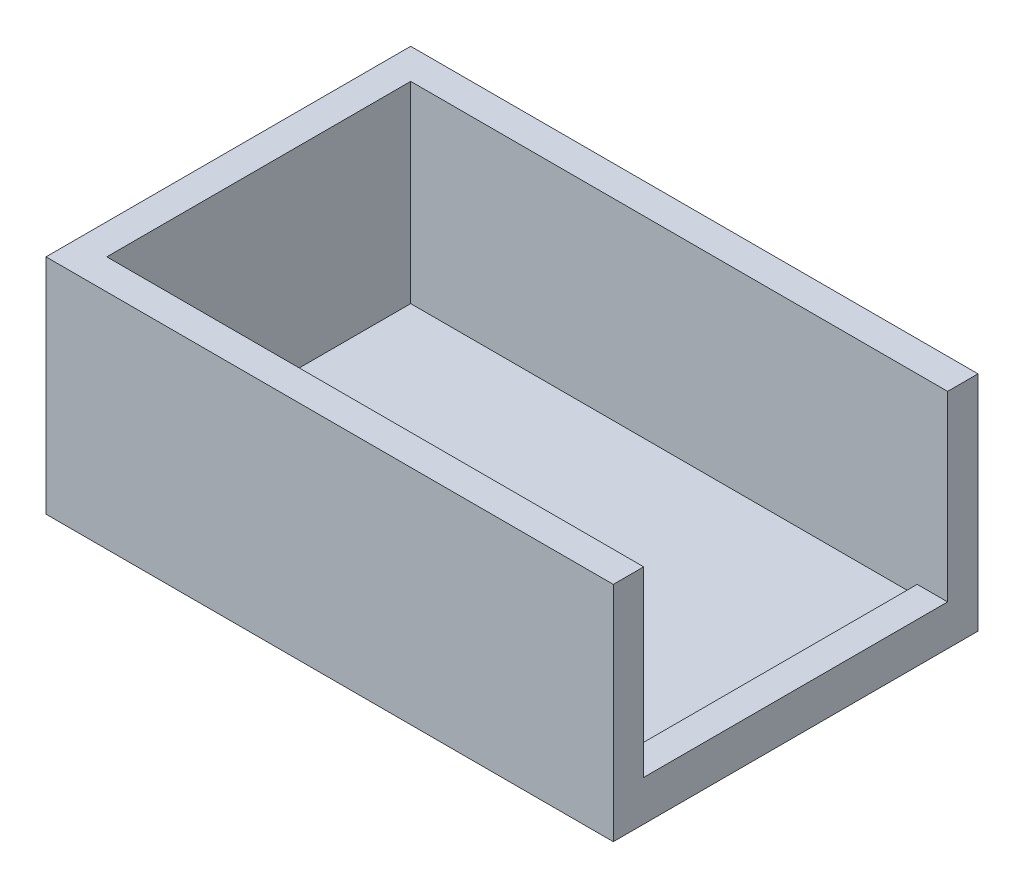
ISO-10303-21;
HEADER;
FILE_DESCRIPTION(('STEP AP214'),'2;1');
FILE_NAME('part.step','',(''),(''),'','','');
FILE_SCHEMA(('AUTOMOTIVE_DESIGN { 1 0 10303 214 1 1 1 1 }'));
ENDSEC;
DATA;
#1=APPLICATION_CONTEXT('core data for automotive mechanical design processes');
#2=APPLICATION_PROTOCOL_DEFINITION('international standard','automotive_design',2000,#1);
#3=PRODUCT_CONTEXT('',#1,'mechanical');
#4=PRODUCT('Part','Part','',(#3));
#5=PRODUCT_RELATED_PRODUCT_CATEGORY('part','',(#4));
#6=PRODUCT_DEFINITION_FORMATION('','',#4);
#7=PRODUCT_DEFINITION_CONTEXT('part definition',#1,'design');
#8=PRODUCT_DEFINITION('design','',#6,#7);
#9=PRODUCT_DEFINITION_SHAPE('','',#8);
#10=(LENGTH_UNIT() NAMED_UNIT(*) SI_UNIT(.MILLI.,.METRE.));
#11=(NAMED_UNIT(*) PLANE_ANGLE_UNIT() SI_UNIT($,.RADIAN.));
#12=(NAMED_UNIT(*) SI_UNIT($,.STERADIAN.) SOLID_ANGLE_UNIT());
#13=UNCERTAINTY_MEASURE_WITH_UNIT(LENGTH_MEASURE(1.E-05),#10,'distance_accuracy_value','');
#14=(GEOMETRIC_REPRESENTATION_CONTEXT(3) GLOBAL_UNCERTAINTY_ASSIGNED_CONTEXT((#13)) GLOBAL_UNIT_ASSIGNED_CONTEXT((#10,
#11,#12)) REPRESENTATION_CONTEXT('',''));
#15=CARTESIAN_POINT('',(0.,0.,0.));
#16=DIRECTION('',(0.,0.,1.));
#17=DIRECTION('',(1.,0.,0.));
#18=AXIS2_PLACEMENT_3D('',#15,#16,#17);
#19=CARTESIAN_POINT('',(25.,3.,-15.));
#20=DIRECTION('',(1.,0.,0.));
#21=DIRECTION('',(0.,0.,-1.));
#22=AXIS2_PLACEMENT_3D('',#19,#20,#21);
#23=PLANE('',#22);
#24=DIRECTION('',(0.,0.,1.));
#25=VECTOR('',#24,1.);
#26=CARTESIAN_POINT('',(25.,4.,-15.));
#27=LINE('',#26,#25);
#28=CARTESIAN_POINT('',(25.,4.,-15.));
#29=VERTEX_POINT('',#28);
#30=CARTESIAN_POINT('',(25.,4.,15.));
#31=VERTEX_POINT('',#30);
#32=EDGE_CURVE('E50',#29,#31,#27,.T.);
#33=ORIENTED_EDGE('',*,*,#32,.F.);
#34=DIRECTION('',(0.,1.,0.));
#35=VECTOR('',#34,1.);
#36=CARTESIAN_POINT('',(25.,3.,-15.));
#37=LINE('',#36,#35);
#38=CARTESIAN_POINT('',(25.,3.,-15.));
#39=VERTEX_POINT('',#38);
#40=EDGE_CURVE('E159',#39,#29,#37,.T.);
#41=ORIENTED_EDGE('',*,*,#40,.F.);
#42=DIRECTION('',(0.,0.,-1.));
#43=VECTOR('',#42,1.);
#44=CARTESIAN_POINT('',(25.,3.,-15.));
#45=LINE('',#44,#43);
#46=CARTESIAN_POINT('',(25.,3.,15.));
#47=VERTEX_POINT('',#46);
#48=EDGE_CURVE('E145',#47,#39,#45,.T.);
#49=ORIENTED_EDGE('',*,*,#48,.F.);
#50=DIRECTION('',(0.,1.,0.));
#51=VECTOR('',#50,1.);
#52=CARTESIAN_POINT('',(25.,3.,15.));
#53=LINE('',#52,#51);
#54=EDGE_CURVE('E162',#47,#31,#53,.T.);
#55=ORIENTED_EDGE('',*,*,#54,.T.);
#56=EDGE_LOOP('',(#33,#41,#49,#55));
#57=FACE_BOUND('',#56,.T.);
#58=ADVANCED_FACE('F35',(#57),#23,.F.);
#59=CARTESIAN_POINT('',(-28.,22.,-18.));
#60=DIRECTION('',(1.,0.,0.));
#61=DIRECTION('',(0.,0.,-1.));
#62=AXIS2_PLACEMENT_3D('',#59,#60,#61);
#63=PLANE('',#62);
#64=DIRECTION('',(0.,0.,1.));
#65=VECTOR('',#64,1.);
#66=CARTESIAN_POINT('',(-28.,0.,-18.));
#67=LINE('',#66,#65);
#68=CARTESIAN_POINT('',(-28.,0.,-18.));
#69=VERTEX_POINT('',#68);
#70=CARTESIAN_POINT('',(-28.,0.,18.));
#71=VERTEX_POINT('',#70);
#72=EDGE_CURVE('E158',#69,#71,#67,.T.);
#73=ORIENTED_EDGE('',*,*,#72,.T.);
#74=DIRECTION('',(0.,-1.,0.));
#75=VECTOR('',#74,1.);
#76=CARTESIAN_POINT('',(-28.,22.,18.));
#77=LINE('',#76,#75);
#78=CARTESIAN_POINT('',(-28.,22.,18.));
#79=VERTEX_POINT('',#78);
#80=EDGE_CURVE('E11',#79,#71,#77,.T.);
#81=ORIENTED_EDGE('',*,*,#80,.F.);
#82=DIRECTION('',(0.,0.,1.));
#83=VECTOR('',#82,1.);
#84=CARTESIAN_POINT('',(-28.,22.,-18.));
#85=LINE('',#84,#83);
#86=CARTESIAN_POINT('',(-28.,22.,-18.));
#87=VERTEX_POINT('',#86);
#88=EDGE_CURVE('E165',#87,#79,#85,.T.);
#89=ORIENTED_EDGE('',*,*,#88,.F.);
#90=DIRECTION('',(0.,-1.,0.));
#91=VECTOR('',#90,1.);
#92=CARTESIAN_POINT('',(-28.,22.,-18.));
#93=LINE('',#92,#91);
#94=EDGE_CURVE('E176',#87,#69,#93,.T.);
#95=ORIENTED_EDGE('',*,*,#94,.T.);
#96=EDGE_LOOP('',(#73,#81,#89,#95));
#97=FACE_BOUND('',#96,.T.);
#98=ADVANCED_FACE('F37',(#97),#63,.F.);
#99=CARTESIAN_POINT('',(-28.,22.,18.));
#100=DIRECTION('',(0.,0.,-1.));
#101=DIRECTION('',(-1.,0.,0.));
#102=AXIS2_PLACEMENT_3D('',#99,#100,#101);
#103=PLANE('',#102);
#104=DIRECTION('',(1.,0.,0.));
#105=VECTOR('',#104,1.);
#106=CARTESIAN_POINT('',(-28.,0.,18.));
#107=LINE('',#106,#105);
#108=CARTESIAN_POINT('',(28.,0.,18.));
#109=VERTEX_POINT('',#108);
#110=EDGE_CURVE('E179',#71,#109,#107,.T.);
#111=ORIENTED_EDGE('',*,*,#110,.T.);
#112=DIRECTION('',(0.,-1.,0.));
#113=VECTOR('',#112,1.);
#114=CARTESIAN_POINT('',(28.,22.,18.));
#115=LINE('',#114,#113);
#116=CARTESIAN_POINT('',(28.,22.,18.));
#117=VERTEX_POINT('',#116);
#118=EDGE_CURVE('E43',#117,#109,#115,.T.);
#119=ORIENTED_EDGE('',*,*,#118,.F.);
#120=DIRECTION('',(1.,0.,0.));
#121=VECTOR('',#120,1.);
#122=CARTESIAN_POINT('',(-28.,22.,18.));
#123=LINE('',#122,#121);
#124=EDGE_CURVE('E168',#79,#117,#123,.T.);
#125=ORIENTED_EDGE('',*,*,#124,.F.);
#126=ORIENTED_EDGE('',*,*,#80,.T.);
#127=EDGE_LOOP('',(#111,#119,#125,#126));
#128=FACE_BOUND('',#127,.T.);
#129=ADVANCED_FACE('F231',(#128),#103,.F.);
#130=CARTESIAN_POINT('',(28.,22.,-18.));
#131=DIRECTION('',(-1.,0.,0.));
#132=DIRECTION('',(0.,0.,1.));
#133=AXIS2_PLACEMENT_3D('',#130,#131,#132);
#134=PLANE('',#133);
#135=DIRECTION('',(0.,0.,-1.));
#136=VECTOR('',#135,1.);
#137=CARTESIAN_POINT('',(28.,22.,-18.));
#138=LINE('',#137,#136);
#139=CARTESIAN_POINT('',(28.,22.,-15.));
#140=VERTEX_POINT('',#139);
#141=CARTESIAN_POINT('',(28.,22.,-18.));
#142=VERTEX_POINT('',#141);
#143=EDGE_CURVE('E171',#140,#142,#138,.T.);
#144=ORIENTED_EDGE('',*,*,#143,.F.);
#145=DIRECTION('',(0.,1.,0.));
#146=VECTOR('',#145,1.);
#147=CARTESIAN_POINT('',(28.,4.,-15.));
#148=LINE('',#147,#146);
#149=CARTESIAN_POINT('',(28.,4.,-15.));
#150=VERTEX_POINT('',#149);
#151=EDGE_CURVE('E122',#150,#140,#148,.T.);
#152=ORIENTED_EDGE('',*,*,#151,.F.);
#153=DIRECTION('',(0.,0.,-1.));
#154=VECTOR('',#153,1.);
#155=CARTESIAN_POINT('',(28.,4.,-15.));
#156=LINE('',#155,#154);
#157=CARTESIAN_POINT('',(28.,4.,15.));
#158=VERTEX_POINT('',#157);
#159=EDGE_CURVE('E126',#158,#150,#156,.T.);
#160=ORIENTED_EDGE('',*,*,#159,.F.);
#161=DIRECTION('',(0.,1.,0.));
#162=VECTOR('',#161,1.);
#163=CARTESIAN_POINT('',(28.,4.,15.));
#164=LINE('',#163,#162);
#165=CARTESIAN_POINT('',(28.,22.,15.));
#166=VERTEX_POINT('',#165);
#167=EDGE_CURVE('E112',#158,#166,#164,.T.);
#168=ORIENTED_EDGE('',*,*,#167,.T.);
#169=EDGE_CURVE('E172',#117,#166,#138,.T.);
#170=ORIENTED_EDGE('',*,*,#169,.F.);
#171=ORIENTED_EDGE('',*,*,#118,.T.);
#172=DIRECTION('',(0.,0.,-1.));
#173=VECTOR('',#172,1.);
#174=CARTESIAN_POINT('',(28.,0.,-18.));
#175=LINE('',#174,#173);
#176=CARTESIAN_POINT('',(28.,0.,-18.));
#177=VERTEX_POINT('',#176);
#178=EDGE_CURVE('E181',#109,#177,#175,.T.);
#179=ORIENTED_EDGE('',*,*,#178,.T.);
#180=DIRECTION('',(0.,-1.,0.));
#181=VECTOR('',#180,1.);
#182=CARTESIAN_POINT('',(28.,22.,-18.));
#183=LINE('',#182,#181);
#184=EDGE_CURVE('E186',#142,#177,#183,.T.);
#185=ORIENTED_EDGE('',*,*,#184,.F.);
#186=EDGE_LOOP('',(#144,#152,#160,#168,#170,#171,#179,#185));
#187=FACE_BOUND('',#186,.T.);
#188=ADVANCED_FACE('F131',(#187),#134,.F.);
#189=CARTESIAN_POINT('',(-28.,22.,-18.));
#190=DIRECTION('',(0.,0.,1.));
#191=DIRECTION('',(1.,0.,0.));
#192=AXIS2_PLACEMENT_3D('',#189,#190,#191);
#193=PLANE('',#192);
#194=DIRECTION('',(-1.,0.,0.));
#195=VECTOR('',#194,1.);
#196=CARTESIAN_POINT('',(-28.,0.,-18.));
#197=LINE('',#196,#195);
#198=EDGE_CURVE('E169',#177,#69,#197,.T.);
#199=ORIENTED_EDGE('',*,*,#198,.T.);
#200=ORIENTED_EDGE('',*,*,#94,.F.);
#201=DIRECTION('',(-1.,0.,0.));
#202=VECTOR('',#201,1.);
#203=CARTESIAN_POINT('',(-28.,22.,-18.));
#204=LINE('',#203,#202);
#205=EDGE_CURVE('E174',#142,#87,#204,.T.);
#206=ORIENTED_EDGE('',*,*,#205,.F.);
#207=ORIENTED_EDGE('',*,*,#184,.T.);
#208=EDGE_LOOP('',(#199,#200,#206,#207));
#209=FACE_BOUND('',#208,.T.);
#210=ADVANCED_FACE('F199',(#209),#193,.F.);
#211=CARTESIAN_POINT('',(0.,22.,0.));
#212=DIRECTION('',(0.,1.,0.));
#213=DIRECTION('',(0.,0.,1.));
#214=AXIS2_PLACEMENT_3D('',#211,#212,#213);
#215=PLANE('',#214);
#216=DIRECTION('',(-1.,0.,0.));
#217=VECTOR('',#216,1.);
#218=CARTESIAN_POINT('',(-25.,22.,-15.));
#219=LINE('',#218,#217);
#220=CARTESIAN_POINT('',(-25.,22.,-15.));
#221=VERTEX_POINT('',#220);
#222=EDGE_CURVE('E142',#140,#221,#219,.T.);
#223=ORIENTED_EDGE('',*,*,#222,.F.);
#224=ORIENTED_EDGE('',*,*,#143,.T.);
#225=ORIENTED_EDGE('',*,*,#205,.T.);
#226=ORIENTED_EDGE('',*,*,#88,.T.);
#227=ORIENTED_EDGE('',*,*,#124,.T.);
#228=ORIENTED_EDGE('',*,*,#169,.T.);
#229=DIRECTION('',(1.,0.,0.));
#230=VECTOR('',#229,1.);
#231=CARTESIAN_POINT('',(-25.,22.,15.));
#232=LINE('',#231,#230);
#233=CARTESIAN_POINT('',(-25.,22.,15.));
#234=VERTEX_POINT('',#233);
#235=EDGE_CURVE('E117',#234,#166,#232,.T.);
#236=ORIENTED_EDGE('',*,*,#235,.F.);
#237=DIRECTION('',(0.,0.,1.));
#238=VECTOR('',#237,1.);
#239=CARTESIAN_POINT('',(-25.,22.,-15.));
#240=LINE('',#239,#238);
#241=EDGE_CURVE('E58',#221,#234,#240,.T.);
#242=ORIENTED_EDGE('',*,*,#241,.F.);
#243=EDGE_LOOP('',(#223,#224,#225,#226,#227,#228,#236,#242));
#244=FACE_BOUND('',#243,.T.);
#245=ADVANCED_FACE('F205',(#244),#215,.T.);
#246=CARTESIAN_POINT('',(0.,0.,0.));
#247=DIRECTION('',(0.,1.,0.));
#248=DIRECTION('',(0.,0.,1.));
#249=AXIS2_PLACEMENT_3D('',#246,#247,#248);
#250=PLANE('',#249);
#251=ORIENTED_EDGE('',*,*,#72,.F.);
#252=ORIENTED_EDGE('',*,*,#198,.F.);
#253=ORIENTED_EDGE('',*,*,#178,.F.);
#254=ORIENTED_EDGE('',*,*,#110,.F.);
#255=EDGE_LOOP('',(#251,#252,#253,#254));
#256=FACE_BOUND('',#255,.T.);
#257=ADVANCED_FACE('F196',(#256),#250,.F.);
#258=CARTESIAN_POINT('',(-25.,3.,-15.));
#259=DIRECTION('',(-1.,0.,0.));
#260=DIRECTION('',(0.,0.,1.));
#261=AXIS2_PLACEMENT_3D('',#258,#259,#260);
#262=PLANE('',#261);
#263=ORIENTED_EDGE('',*,*,#241,.T.);
#264=DIRECTION('',(0.,1.,0.));
#265=VECTOR('',#264,1.);
#266=CARTESIAN_POINT('',(-25.,3.,15.));
#267=LINE('',#266,#265);
#268=CARTESIAN_POINT('',(-25.,3.,15.));
#269=VERTEX_POINT('',#268);
#270=EDGE_CURVE('E151',#269,#234,#267,.T.);
#271=ORIENTED_EDGE('',*,*,#270,.F.);
#272=DIRECTION('',(0.,0.,1.));
#273=VECTOR('',#272,1.);
#274=CARTESIAN_POINT('',(-25.,3.,-15.));
#275=LINE('',#274,#273);
#276=CARTESIAN_POINT('',(-25.,3.,-15.));
#277=VERTEX_POINT('',#276);
#278=EDGE_CURVE('E138',#277,#269,#275,.T.);
#279=ORIENTED_EDGE('',*,*,#278,.F.);
#280=DIRECTION('',(0.,1.,0.));
#281=VECTOR('',#280,1.);
#282=CARTESIAN_POINT('',(-25.,3.,-15.));
#283=LINE('',#282,#281);
#284=EDGE_CURVE('E156',#277,#221,#283,.T.);
#285=ORIENTED_EDGE('',*,*,#284,.T.);
#286=EDGE_LOOP('',(#263,#271,#279,#285));
#287=FACE_BOUND('',#286,.T.);
#288=ADVANCED_FACE('F215',(#287),#262,.F.);
#289=CARTESIAN_POINT('',(-25.,3.,-15.));
#290=DIRECTION('',(0.,0.,-1.));
#291=DIRECTION('',(-1.,0.,0.));
#292=AXIS2_PLACEMENT_3D('',#289,#290,#291);
#293=PLANE('',#292);
#294=ORIENTED_EDGE('',*,*,#222,.T.);
#295=ORIENTED_EDGE('',*,*,#284,.F.);
#296=DIRECTION('',(-1.,0.,0.));
#297=VECTOR('',#296,1.);
#298=CARTESIAN_POINT('',(-25.,3.,-15.));
#299=LINE('',#298,#297);
#300=EDGE_CURVE('E148',#39,#277,#299,.T.);
#301=ORIENTED_EDGE('',*,*,#300,.F.);
#302=ORIENTED_EDGE('',*,*,#40,.T.);
#303=DIRECTION('',(-1.,0.,0.));
#304=VECTOR('',#303,1.);
#305=CARTESIAN_POINT('',(25.,4.,-15.));
#306=LINE('',#305,#304);
#307=EDGE_CURVE('E123',#150,#29,#306,.T.);
#308=ORIENTED_EDGE('',*,*,#307,.F.);
#309=ORIENTED_EDGE('',*,*,#151,.T.);
#310=EDGE_LOOP('',(#294,#295,#301,#302,#308,#309));
#311=FACE_BOUND('',#310,.T.);
#312=ADVANCED_FACE('F207',(#311),#293,.F.);
#313=CARTESIAN_POINT('',(-25.,3.,15.));
#314=DIRECTION('',(0.,0.,1.));
#315=DIRECTION('',(1.,0.,0.));
#316=AXIS2_PLACEMENT_3D('',#313,#314,#315);
#317=PLANE('',#316);
#318=ORIENTED_EDGE('',*,*,#235,.T.);
#319=ORIENTED_EDGE('',*,*,#167,.F.);
#320=DIRECTION('',(1.,0.,0.));
#321=VECTOR('',#320,1.);
#322=CARTESIAN_POINT('',(25.,4.,15.));
#323=LINE('',#322,#321);
#324=EDGE_CURVE('E114',#31,#158,#323,.T.);
#325=ORIENTED_EDGE('',*,*,#324,.F.);
#326=ORIENTED_EDGE('',*,*,#54,.F.);
#327=DIRECTION('',(1.,0.,0.));
#328=VECTOR('',#327,1.);
#329=CARTESIAN_POINT('',(-25.,3.,15.));
#330=LINE('',#329,#328);
#331=EDGE_CURVE('E141',#269,#47,#330,.T.);
#332=ORIENTED_EDGE('',*,*,#331,.F.);
#333=ORIENTED_EDGE('',*,*,#270,.T.);
#334=EDGE_LOOP('',(#318,#319,#325,#326,#332,#333));
#335=FACE_BOUND('',#334,.T.);
#336=ADVANCED_FACE('F113',(#335),#317,.F.);
#337=CARTESIAN_POINT('',(0.,3.,0.));
#338=DIRECTION('',(0.,1.,0.));
#339=DIRECTION('',(0.,0.,1.));
#340=AXIS2_PLACEMENT_3D('',#337,#338,#339);
#341=PLANE('',#340);
#342=ORIENTED_EDGE('',*,*,#278,.T.);
#343=ORIENTED_EDGE('',*,*,#331,.T.);
#344=ORIENTED_EDGE('',*,*,#48,.T.);
#345=ORIENTED_EDGE('',*,*,#300,.T.);
#346=EDGE_LOOP('',(#342,#343,#344,#345));
#347=FACE_BOUND('',#346,.T.);
#348=ADVANCED_FACE('F214',(#347),#341,.T.);
#349=CARTESIAN_POINT('',(0.,4.,0.));
#350=DIRECTION('',(0.,1.,0.));
#351=DIRECTION('',(0.,0.,1.));
#352=AXIS2_PLACEMENT_3D('',#349,#350,#351);
#353=PLANE('',#352);
#354=ORIENTED_EDGE('',*,*,#32,.T.);
#355=ORIENTED_EDGE('',*,*,#324,.T.);
#356=ORIENTED_EDGE('',*,*,#159,.T.);
#357=ORIENTED_EDGE('',*,*,#307,.T.);
#358=EDGE_LOOP('',(#354,#355,#356,#357));
#359=FACE_BOUND('',#358,.T.);
#360=ADVANCED_FACE('F125',(#359),#353,.T.);
#361=CLOSED_SHELL('',(#58,#98,#129,#188,#210,#245,#257,#288,#312,#336,#348,#360));
#362=MANIFOLD_SOLID_BREP('B2',#361);
#363=ADVANCED_BREP_SHAPE_REPRESENTATION('',(#18,#362),#14);
#364=SHAPE_DEFINITION_REPRESENTATION(#9,#363);
ENDSEC;
END-ISO-10303-21;
